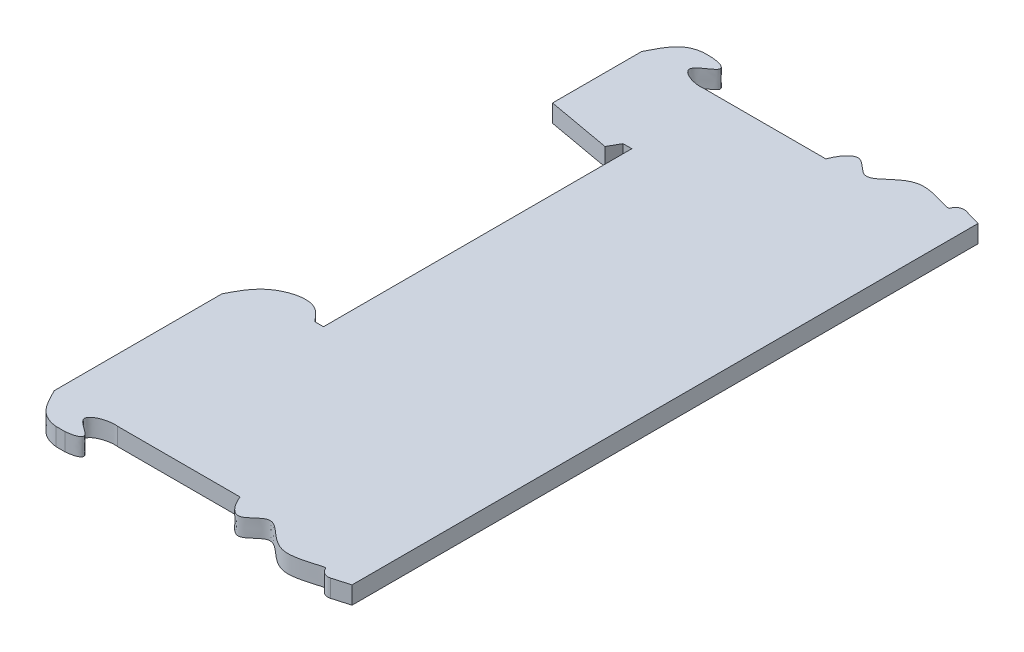
ISO-10303-21;
HEADER;
FILE_DESCRIPTION(('STEP AP214'),'2;1');
FILE_NAME('part.step','',(''),(''),'','','');
FILE_SCHEMA(('AUTOMOTIVE_DESIGN { 1 0 10303 214 1 1 1 1 }'));
ENDSEC;
DATA;
#1=APPLICATION_CONTEXT('core data for automotive mechanical design processes');
#2=APPLICATION_PROTOCOL_DEFINITION('international standard','automotive_design',2000,#1);
#3=PRODUCT_CONTEXT('',#1,'mechanical');
#4=PRODUCT('Part','Part','',(#3));
#5=PRODUCT_RELATED_PRODUCT_CATEGORY('part','',(#4));
#6=PRODUCT_DEFINITION_FORMATION('','',#4);
#7=PRODUCT_DEFINITION_CONTEXT('part definition',#1,'design');
#8=PRODUCT_DEFINITION('design','',#6,#7);
#9=PRODUCT_DEFINITION_SHAPE('','',#8);
#10=(LENGTH_UNIT() NAMED_UNIT(*) SI_UNIT(.MILLI.,.METRE.));
#11=(NAMED_UNIT(*) PLANE_ANGLE_UNIT() SI_UNIT($,.RADIAN.));
#12=(NAMED_UNIT(*) SI_UNIT($,.STERADIAN.) SOLID_ANGLE_UNIT());
#13=UNCERTAINTY_MEASURE_WITH_UNIT(LENGTH_MEASURE(1.E-05),#10,'distance_accuracy_value','');
#14=(GEOMETRIC_REPRESENTATION_CONTEXT(3) GLOBAL_UNCERTAINTY_ASSIGNED_CONTEXT((#13)) GLOBAL_UNIT_ASSIGNED_CONTEXT((#10,
#11,#12)) REPRESENTATION_CONTEXT('',''));
#15=CARTESIAN_POINT('',(0.,0.,0.));
#16=DIRECTION('',(0.,0.,1.));
#17=DIRECTION('',(1.,0.,0.));
#18=AXIS2_PLACEMENT_3D('',#15,#16,#17);
#19=CARTESIAN_POINT('',(18.,-5.2,36.75));
#20=DIRECTION('',(1.,0.,0.));
#21=DIRECTION('',(0.,0.,-1.));
#22=AXIS2_PLACEMENT_3D('',#19,#20,#21);
#23=PLANE('',#22);
#24=DIRECTION('',(0.,0.,-1.));
#25=VECTOR('',#24,1.);
#26=CARTESIAN_POINT('',(18.,-3.2,36.75));
#27=LINE('',#26,#25);
#28=CARTESIAN_POINT('',(18.,-3.2,35.5290024315562));
#29=VERTEX_POINT('',#28);
#30=CARTESIAN_POINT('',(18.,-3.2,-35.5290024315562));
#31=VERTEX_POINT('',#30);
#32=EDGE_CURVE('E219',#29,#31,#27,.T.);
#33=ORIENTED_EDGE('',*,*,#32,.F.);
#34=DIRECTION('',(0.,-1.,0.));
#35=VECTOR('',#34,1.);
#36=CARTESIAN_POINT('',(18.,12.8155228725859,35.5290024315562));
#37=LINE('',#36,#35);
#38=CARTESIAN_POINT('',(18.,-5.2,35.5290024315562));
#39=VERTEX_POINT('',#38);
#40=EDGE_CURVE('E399',#29,#39,#37,.T.);
#41=ORIENTED_EDGE('',*,*,#40,.T.);
#42=DIRECTION('',(0.,0.,-1.));
#43=VECTOR('',#42,1.);
#44=CARTESIAN_POINT('',(18.,-5.2,36.75));
#45=LINE('',#44,#43);
#46=CARTESIAN_POINT('',(18.,-5.2,-35.5290024315562));
#47=VERTEX_POINT('',#46);
#48=EDGE_CURVE('E447',#39,#47,#45,.T.);
#49=ORIENTED_EDGE('',*,*,#48,.T.);
#50=DIRECTION('',(0.,-1.,0.));
#51=VECTOR('',#50,1.);
#52=CARTESIAN_POINT('',(18.,12.8155228725859,-35.5290024315562));
#53=LINE('',#52,#51);
#54=EDGE_CURVE('E477',#31,#47,#53,.T.);
#55=ORIENTED_EDGE('',*,*,#54,.F.);
#56=EDGE_LOOP('',(#33,#41,#49,#55));
#57=FACE_BOUND('',#56,.T.);
#58=ADVANCED_FACE('F18',(#57),#23,.T.);
#59=CARTESIAN_POINT('',(0.,-3.2,0.));
#60=DIRECTION('',(0.,1.,0.));
#61=DIRECTION('',(0.,0.,1.));
#62=AXIS2_PLACEMENT_3D('',#59,#60,#61);
#63=PLANE('',#62);
#64=DIRECTION('',(-0.960334640778332,0.,-0.278850099015855));
#65=VECTOR('',#64,1.);
#66=CARTESIAN_POINT('',(10.9139233862696,-3.2,-37.586569743479));
#67=LINE('',#66,#65);
#68=CARTESIAN_POINT('',(16.1226792681748,-3.2,-36.0741156136962));
#69=VERTEX_POINT('',#68);
#70=EDGE_CURVE('E216',#31,#69,#67,.T.);
#71=ORIENTED_EDGE('',*,*,#70,.T.);
#72=CARTESIAN_POINT('',(15.843829169159,-3.2,-35.1137809729179));
#73=DIRECTION('',(0.,1.,0.));
#74=DIRECTION('',(0.,0.,1.));
#75=AXIS2_PLACEMENT_3D('',#72,#73,#74);
#76=CIRCLE('',#75,1.);
#77=CARTESIAN_POINT('',(14.8953796117993,-3.2,-35.4307090990666));
#78=VERTEX_POINT('',#77);
#79=EDGE_CURVE('E11',#69,#78,#76,.T.);
#80=ORIENTED_EDGE('',*,*,#79,.T.);
#81=CARTESIAN_POINT('',(3.00913606257908,-3.2,-33.242524045389));
#82=CARTESIAN_POINT('',(3.34394664913683,-3.2,-34.149968857225));
#83=CARTESIAN_POINT('',(4.66208874772011,-3.2,-36.1968047385293));
#84=CARTESIAN_POINT('',(7.44187242346422,-3.2,-32.2204982551719));
#85=CARTESIAN_POINT('',(9.70858705585306,-3.2,-37.9023329455668));
#86=CARTESIAN_POINT('',(16.0944724333241,-3.2,-34.3443957451506));
#87=CARTESIAN_POINT('',(14.271829047182,-3.2,-36.3841670545182));
#88=CARTESIAN_POINT('',(13.7949942803641,-3.2,-36.75));
#89=B_SPLINE_CURVE_WITH_KNOTS('',3,(#81,#82,#83,#84,#85,#86,#87,#88),.UNSPECIFIED.,.F.,.F.,(4,1,
1,1,1,4),(0.,0.172582068816832,0.317794724151336,0.633383270513378,0.89276460620187,1.),.UNSPECIFIED.);
#90=CARTESIAN_POINT('',(3.00913606257908,-3.2,-33.242524045389));
#91=VERTEX_POINT('',#90);
#92=EDGE_CURVE('E126',#78,#91,#89,.F.);
#93=ORIENTED_EDGE('',*,*,#92,.T.);
#94=DIRECTION('',(-1.,0.,0.));
#95=VECTOR('',#94,1.);
#96=CARTESIAN_POINT('',(0.,-3.2,-33.242524045389));
#97=LINE('',#96,#95);
#98=CARTESIAN_POINT('',(-10.9089135006158,-3.2,-33.242524045389));
#99=VERTEX_POINT('',#98);
#100=EDGE_CURVE('E302',#91,#99,#97,.T.);
#101=ORIENTED_EDGE('',*,*,#100,.T.);
#102=CARTESIAN_POINT('',(-13.3800349437671,-3.2,-36.75));
#103=CARTESIAN_POINT('',(-12.5292903543223,-3.2,-36.6777766997607));
#104=CARTESIAN_POINT('',(-10.8142711101948,-3.2,-36.1236577690734));
#105=CARTESIAN_POINT('',(-15.160513473741,-3.2,-34.2468955948164));
#106=CARTESIAN_POINT('',(-11.9595228161076,-3.2,-33.0989340595605));
#107=CARTESIAN_POINT('',(-10.9089135006158,-3.2,-33.242524045389));
#108=B_SPLINE_CURVE_WITH_KNOTS('',3,(#102,#103,#104,#105,#106,#107),.UNSPECIFIED.,.F.,.F.,(4,1,
1,4),(0.,0.263554408092284,0.594106929046082,1.),.UNSPECIFIED.);
#109=CARTESIAN_POINT('',(-13.3800349437671,-3.2,-36.75));
#110=VERTEX_POINT('',#109);
#111=EDGE_CURVE('E296',#99,#110,#108,.F.);
#112=ORIENTED_EDGE('',*,*,#111,.T.);
#113=DIRECTION('',(-1.,0.,0.));
#114=VECTOR('',#113,1.);
#115=CARTESIAN_POINT('',(18.,-3.2,-36.75));
#116=LINE('',#115,#114);
#117=CARTESIAN_POINT('',(-14.3883371317396,-3.2,-36.75));
#118=VERTEX_POINT('',#117);
#119=EDGE_CURVE('E222',#110,#118,#116,.T.);
#120=ORIENTED_EDGE('',*,*,#119,.T.);
#121=CARTESIAN_POINT('',(-18.,-3.2,-33.3419361491354));
#122=CARTESIAN_POINT('',(-17.1670048895105,-3.2,-34.9610055613672));
#123=CARTESIAN_POINT('',(-16.5120609184126,-3.2,-36.5502275298261));
#124=CARTESIAN_POINT('',(-14.3883371317396,-3.2,-36.75));
#125=B_SPLINE_CURVE_WITH_KNOTS('',3,(#121,#122,#123,#124),.UNSPECIFIED.,.F.,.F.,(4,4),(0.,1.),.UNSPECIFIED.);
#126=CARTESIAN_POINT('',(-18.,-3.2,-33.3419361491354));
#127=VERTEX_POINT('',#126);
#128=EDGE_CURVE('E284',#118,#127,#125,.F.);
#129=ORIENTED_EDGE('',*,*,#128,.T.);
#130=DIRECTION('',(0.,0.,1.));
#131=VECTOR('',#130,1.);
#132=CARTESIAN_POINT('',(-18.,-3.2,-36.75));
#133=LINE('',#132,#131);
#134=CARTESIAN_POINT('',(-18.,-3.2,-23.2298126801153));
#135=VERTEX_POINT('',#134);
#136=EDGE_CURVE('E261',#127,#135,#133,.T.);
#137=ORIENTED_EDGE('',*,*,#136,.T.);
#138=DIRECTION('',(-0.984246247911353,0.,-0.176803064092297));
#139=VECTOR('',#138,1.);
#140=CARTESIAN_POINT('',(3.47973196997268,-3.2,-19.3713449072064));
#141=LINE('',#140,#139);
#142=CARTESIAN_POINT('',(-10.7416100589357,-3.2,-21.9259666307347));
#143=VERTEX_POINT('',#142);
#144=EDGE_CURVE('E247',#143,#135,#141,.T.);
#145=ORIENTED_EDGE('',*,*,#144,.F.);
#146=DIRECTION('',(-0.494406705957166,0.,0.869230699587045));
#147=VECTOR('',#146,1.);
#148=CARTESIAN_POINT('',(-17.5387130903516,-3.2,-9.97578360940098));
#149=LINE('',#148,#147);
#150=CARTESIAN_POINT('',(-10.,-3.2,-23.2298126801153));
#151=VERTEX_POINT('',#150);
#152=EDGE_CURVE('E276',#151,#143,#149,.T.);
#153=ORIENTED_EDGE('',*,*,#152,.F.);
#154=DIRECTION('',(-1.,0.,0.));
#155=VECTOR('',#154,1.);
#156=CARTESIAN_POINT('',(0.,-3.2,-23.2298126801153));
#157=LINE('',#156,#155);
#158=CARTESIAN_POINT('',(-9.,-3.2,-23.2298126801153));
#159=VERTEX_POINT('',#158);
#160=EDGE_CURVE('E274',#159,#151,#157,.T.);
#161=ORIENTED_EDGE('',*,*,#160,.F.);
#162=DIRECTION('',(0.,0.,-1.));
#163=VECTOR('',#162,1.);
#164=CARTESIAN_POINT('',(-9.,-3.2,0.));
#165=LINE('',#164,#163);
#166=CARTESIAN_POINT('',(-9.,-3.2,11.7701873198847));
#167=VERTEX_POINT('',#166);
#168=EDGE_CURVE('E272',#167,#159,#165,.T.);
#169=ORIENTED_EDGE('',*,*,#168,.F.);
#170=DIRECTION('',(1.,0.,0.));
#171=VECTOR('',#170,1.);
#172=CARTESIAN_POINT('',(0.,-3.2,11.7701873198847));
#173=LINE('',#172,#171);
#174=CARTESIAN_POINT('',(-10.,-3.2,11.7701873198847));
#175=VERTEX_POINT('',#174);
#176=EDGE_CURVE('E266',#175,#167,#173,.T.);
#177=ORIENTED_EDGE('',*,*,#176,.F.);
#178=CARTESIAN_POINT('',(-10.,-3.2,11.7701873198847));
#179=CARTESIAN_POINT('',(-10.4766283127593,-3.2,11.1657315515805));
#180=CARTESIAN_POINT('',(-11.8182497629508,-3.2,9.56827475012417));
#181=CARTESIAN_POINT('',(-16.0576619839344,-3.2,10.7099109528241));
#182=CARTESIAN_POINT('',(-17.3288762015723,-3.2,12.9543463623666));
#183=CARTESIAN_POINT('',(-18.,-3.2,14.3089544996092));
#184=B_SPLINE_CURVE_WITH_KNOTS('',3,(#178,#179,#180,#181,#182,#183),.UNSPECIFIED.,.F.,.F.,(4,1,
1,4),(0.,0.204787098549057,0.597818984755,1.),.UNSPECIFIED.);
#185=CARTESIAN_POINT('',(-18.,-3.2,14.3089544996092));
#186=VERTEX_POINT('',#185);
#187=EDGE_CURVE('E262',#186,#175,#184,.F.);
#188=ORIENTED_EDGE('',*,*,#187,.F.);
#189=DIRECTION('',(0.,0.,1.));
#190=VECTOR('',#189,1.);
#191=CARTESIAN_POINT('',(-18.,-3.2,-36.75));
#192=LINE('',#191,#190);
#193=CARTESIAN_POINT('',(-18.,-3.2,33.3419361491354));
#194=VERTEX_POINT('',#193);
#195=EDGE_CURVE('E254',#186,#194,#192,.T.);
#196=ORIENTED_EDGE('',*,*,#195,.T.);
#197=CARTESIAN_POINT('',(-14.3883371317396,-3.2,36.75));
#198=CARTESIAN_POINT('',(-16.5120609184126,-3.2,36.5502275298261));
#199=CARTESIAN_POINT('',(-17.1670048895105,-3.2,34.9610055613672));
#200=CARTESIAN_POINT('',(-18.,-3.2,33.3419361491354));
#201=B_SPLINE_CURVE_WITH_KNOTS('',3,(#197,#198,#199,#200),.UNSPECIFIED.,.F.,.F.,(4,4),(0.,1.),.UNSPECIFIED.);
#202=CARTESIAN_POINT('',(-14.3883371317396,-3.2,36.75));
#203=VERTEX_POINT('',#202);
#204=EDGE_CURVE('E248',#194,#203,#201,.F.);
#205=ORIENTED_EDGE('',*,*,#204,.T.);
#206=DIRECTION('',(1.,0.,0.));
#207=VECTOR('',#206,1.);
#208=CARTESIAN_POINT('',(-18.,-3.2,36.75));
#209=LINE('',#208,#207);
#210=CARTESIAN_POINT('',(-13.3800349437672,-3.2,36.75));
#211=VERTEX_POINT('',#210);
#212=EDGE_CURVE('E223',#203,#211,#209,.T.);
#213=ORIENTED_EDGE('',*,*,#212,.T.);
#214=CARTESIAN_POINT('',(-10.9089135006158,-3.2,33.242524045389));
#215=CARTESIAN_POINT('',(-11.9595228161076,-3.2,33.0989340595605));
#216=CARTESIAN_POINT('',(-15.160513473741,-3.2,34.2468955948164));
#217=CARTESIAN_POINT('',(-10.8142711101948,-3.2,36.1236577690734));
#218=CARTESIAN_POINT('',(-12.5292903543224,-3.2,36.6777766997607));
#219=CARTESIAN_POINT('',(-13.3800349437672,-3.2,36.75));
#220=B_SPLINE_CURVE_WITH_KNOTS('',3,(#214,#215,#216,#217,#218,#219),.UNSPECIFIED.,.F.,.F.,(4,1,
1,4),(0.,0.405893070953915,0.73644559190771,1.),.UNSPECIFIED.);
#221=CARTESIAN_POINT('',(-10.9089135006158,-3.2,33.242524045389));
#222=VERTEX_POINT('',#221);
#223=EDGE_CURVE('E237',#211,#222,#220,.F.);
#224=ORIENTED_EDGE('',*,*,#223,.T.);
#225=DIRECTION('',(1.,0.,0.));
#226=VECTOR('',#225,1.);
#227=CARTESIAN_POINT('',(0.,-3.2,33.242524045389));
#228=LINE('',#227,#226);
#229=CARTESIAN_POINT('',(3.00913606257908,-3.2,33.242524045389));
#230=VERTEX_POINT('',#229);
#231=EDGE_CURVE('E230',#222,#230,#228,.T.);
#232=ORIENTED_EDGE('',*,*,#231,.T.);
#233=CARTESIAN_POINT('',(13.7949942803641,-3.2,36.75));
#234=CARTESIAN_POINT('',(14.271829047182,-3.2,36.3841670545182));
#235=CARTESIAN_POINT('',(16.0944724333241,-3.2,34.3443957451506));
#236=CARTESIAN_POINT('',(9.70858705585306,-3.2,37.9023329455668));
#237=CARTESIAN_POINT('',(7.44187242346422,-3.2,32.2204982551719));
#238=CARTESIAN_POINT('',(4.66208874772011,-3.2,36.1968047385293));
#239=CARTESIAN_POINT('',(3.34394664913683,-3.2,34.149968857225));
#240=CARTESIAN_POINT('',(3.00913606257908,-3.2,33.242524045389));
#241=B_SPLINE_CURVE_WITH_KNOTS('',3,(#233,#234,#235,#236,#237,#238,#239,#240),.UNSPECIFIED.,.F.,
.F.,(4,1,1,1,1,4),(0.,0.10723539379813,0.366616729486621,0.682205275848664,0.827417931183168,
1.),.UNSPECIFIED.);
#242=CARTESIAN_POINT('',(14.8953796117993,-3.2,35.4307090990666));
#243=VERTEX_POINT('',#242);
#244=EDGE_CURVE('E226',#230,#243,#241,.F.);
#245=ORIENTED_EDGE('',*,*,#244,.T.);
#246=CARTESIAN_POINT('',(15.843829169159,-3.2,35.1137809729178));
#247=DIRECTION('',(0.,1.,0.));
#248=DIRECTION('',(0.,0.,1.));
#249=AXIS2_PLACEMENT_3D('',#246,#247,#248);
#250=CIRCLE('',#249,1.);
#251=CARTESIAN_POINT('',(16.1226792681749,-3.2,36.0741156136962));
#252=VERTEX_POINT('',#251);
#253=EDGE_CURVE('E206',#243,#252,#250,.T.);
#254=ORIENTED_EDGE('',*,*,#253,.T.);
#255=DIRECTION('',(0.960334640778332,0.,-0.278850099015855));
#256=VECTOR('',#255,1.);
#257=CARTESIAN_POINT('',(10.9139233862696,-3.2,37.586569743479));
#258=LINE('',#257,#256);
#259=EDGE_CURVE('E218',#252,#29,#258,.T.);
#260=ORIENTED_EDGE('',*,*,#259,.T.);
#261=ORIENTED_EDGE('',*,*,#32,.T.);
#262=EDGE_LOOP('',(#71,#80,#93,#101,#112,#120,#129,#137,#145,#153,#161,#169,#177,#188,#196,#205,
#213,#224,#232,#245,#254,#260,#261));
#263=FACE_BOUND('',#262,.T.);
#264=ADVANCED_FACE('F20',(#263),#63,.T.);
#265=CARTESIAN_POINT('',(18.,-5.2,-36.75));
#266=DIRECTION('',(0.,0.,-1.));
#267=DIRECTION('',(-1.,0.,0.));
#268=AXIS2_PLACEMENT_3D('',#265,#266,#267);
#269=PLANE('',#268);
#270=ORIENTED_EDGE('',*,*,#119,.F.);
#271=DIRECTION('',(0.,-1.,0.));
#272=VECTOR('',#271,1.);
#273=CARTESIAN_POINT('',(-13.3800349437671,12.8155228725859,-36.75));
#274=LINE('',#273,#272);
#275=CARTESIAN_POINT('',(-13.3800349437671,-5.2,-36.75));
#276=VERTEX_POINT('',#275);
#277=EDGE_CURVE('E306',#110,#276,#274,.T.);
#278=ORIENTED_EDGE('',*,*,#277,.T.);
#279=DIRECTION('',(-1.,0.,0.));
#280=VECTOR('',#279,1.);
#281=CARTESIAN_POINT('',(18.,-5.2,-36.75));
#282=LINE('',#281,#280);
#283=CARTESIAN_POINT('',(-14.3883371317396,-5.2,-36.75));
#284=VERTEX_POINT('',#283);
#285=EDGE_CURVE('E451',#276,#284,#282,.T.);
#286=ORIENTED_EDGE('',*,*,#285,.T.);
#287=DIRECTION('',(0.,-1.,0.));
#288=VECTOR('',#287,1.);
#289=CARTESIAN_POINT('',(-14.3883371317396,12.8155228725859,-36.75));
#290=LINE('',#289,#288);
#291=EDGE_CURVE('E290',#118,#284,#290,.T.);
#292=ORIENTED_EDGE('',*,*,#291,.F.);
#293=EDGE_LOOP('',(#270,#278,#286,#292));
#294=FACE_BOUND('',#293,.T.);
#295=ADVANCED_FACE('F516',(#294),#269,.T.);
#296=CARTESIAN_POINT('',(-18.,-5.2,-36.75));
#297=DIRECTION('',(-1.,0.,0.));
#298=DIRECTION('',(0.,0.,1.));
#299=AXIS2_PLACEMENT_3D('',#296,#297,#298);
#300=PLANE('',#299);
#301=ORIENTED_EDGE('',*,*,#136,.F.);
#302=DIRECTION('',(0.,-1.,0.));
#303=VECTOR('',#302,1.);
#304=CARTESIAN_POINT('',(-18.,12.8155228725859,-33.3419361491354));
#305=LINE('',#304,#303);
#306=CARTESIAN_POINT('',(-18.,-5.2,-33.3419361491354));
#307=VERTEX_POINT('',#306);
#308=EDGE_CURVE('E556',#127,#307,#305,.T.);
#309=ORIENTED_EDGE('',*,*,#308,.T.);
#310=DIRECTION('',(0.,0.,1.));
#311=VECTOR('',#310,1.);
#312=CARTESIAN_POINT('',(-18.,-5.2,-36.75));
#313=LINE('',#312,#311);
#314=CARTESIAN_POINT('',(-18.,-5.2,-23.2298126801153));
#315=VERTEX_POINT('',#314);
#316=EDGE_CURVE('E224',#307,#315,#313,.T.);
#317=ORIENTED_EDGE('',*,*,#316,.T.);
#318=DIRECTION('',(0.,-1.,0.));
#319=VECTOR('',#318,1.);
#320=CARTESIAN_POINT('',(-18.,34.6858787151251,-23.2298126801153));
#321=LINE('',#320,#319);
#322=EDGE_CURVE('E267',#135,#315,#321,.T.);
#323=ORIENTED_EDGE('',*,*,#322,.F.);
#324=EDGE_LOOP('',(#301,#309,#317,#323));
#325=FACE_BOUND('',#324,.T.);
#326=ADVANCED_FACE('F523',(#325),#300,.T.);
#327=CARTESIAN_POINT('',(-18.,-5.2,36.75));
#328=DIRECTION('',(0.,0.,1.));
#329=DIRECTION('',(1.,0.,0.));
#330=AXIS2_PLACEMENT_3D('',#327,#328,#329);
#331=PLANE('',#330);
#332=ORIENTED_EDGE('',*,*,#212,.F.);
#333=DIRECTION('',(0.,-1.,0.));
#334=VECTOR('',#333,1.);
#335=CARTESIAN_POINT('',(-14.3883371317396,12.8155228725859,36.75));
#336=LINE('',#335,#334);
#337=CARTESIAN_POINT('',(-14.3883371317396,-5.2,36.75));
#338=VERTEX_POINT('',#337);
#339=EDGE_CURVE('E253',#203,#338,#336,.T.);
#340=ORIENTED_EDGE('',*,*,#339,.T.);
#341=DIRECTION('',(1.,0.,0.));
#342=VECTOR('',#341,1.);
#343=CARTESIAN_POINT('',(-18.,-5.2,36.75));
#344=LINE('',#343,#342);
#345=CARTESIAN_POINT('',(-13.3800349437672,-5.2,36.75));
#346=VERTEX_POINT('',#345);
#347=EDGE_CURVE('E283',#338,#346,#344,.T.);
#348=ORIENTED_EDGE('',*,*,#347,.T.);
#349=DIRECTION('',(0.,-1.,0.));
#350=VECTOR('',#349,1.);
#351=CARTESIAN_POINT('',(-13.3800349437672,12.8155228725859,36.75));
#352=LINE('',#351,#350);
#353=EDGE_CURVE('E231',#211,#346,#352,.T.);
#354=ORIENTED_EDGE('',*,*,#353,.F.);
#355=EDGE_LOOP('',(#332,#340,#348,#354));
#356=FACE_BOUND('',#355,.T.);
#357=ADVANCED_FACE('F520',(#356),#331,.T.);
#358=DIRECTION('',(0.,-1.,0.));
#359=VECTOR('',#358,1.);
#360=CARTESIAN_POINT('',(-18.,12.8155228725859,33.3419361491354));
#361=LINE('',#360,#359);
#362=CARTESIAN_POINT('',(-18.,-5.2,33.3419361491354));
#363=VERTEX_POINT('',#362);
#364=EDGE_CURVE('E360',#194,#363,#361,.T.);
#365=ORIENTED_EDGE('',*,*,#364,.F.);
#366=ORIENTED_EDGE('',*,*,#195,.F.);
#367=DIRECTION('',(0.,-1.,0.));
#368=VECTOR('',#367,1.);
#369=CARTESIAN_POINT('',(-18.,34.6858787151251,14.3089544996092));
#370=LINE('',#369,#368);
#371=CARTESIAN_POINT('',(-18.,-5.2,14.3089544996092));
#372=VERTEX_POINT('',#371);
#373=EDGE_CURVE('E429',#186,#372,#370,.T.);
#374=ORIENTED_EDGE('',*,*,#373,.T.);
#375=EDGE_CURVE('E453',#372,#363,#313,.T.);
#376=ORIENTED_EDGE('',*,*,#375,.T.);
#377=EDGE_LOOP('',(#365,#366,#374,#376));
#378=FACE_BOUND('',#377,.T.);
#379=ADVANCED_FACE('F522',(#378),#300,.T.);
#380=CARTESIAN_POINT('',(0.,-5.2,0.));
#381=DIRECTION('',(0.,1.,0.));
#382=DIRECTION('',(0.,0.,1.));
#383=AXIS2_PLACEMENT_3D('',#380,#381,#382);
#384=PLANE('',#383);
#385=CARTESIAN_POINT('',(3.00913606257908,-5.2,-33.242524045389));
#386=CARTESIAN_POINT('',(3.34394664913683,-5.2,-34.149968857225));
#387=CARTESIAN_POINT('',(4.66208874772011,-5.2,-36.1968047385293));
#388=CARTESIAN_POINT('',(7.44187242346422,-5.2,-32.2204982551719));
#389=CARTESIAN_POINT('',(9.70858705585306,-5.2,-37.9023329455668));
#390=CARTESIAN_POINT('',(16.0944724333241,-5.2,-34.3443957451506));
#391=CARTESIAN_POINT('',(14.271829047182,-5.2,-36.3841670545182));
#392=CARTESIAN_POINT('',(13.7949942803641,-5.2,-36.75));
#393=B_SPLINE_CURVE_WITH_KNOTS('',3,(#385,#386,#387,#388,#389,#390,#391,#392),.UNSPECIFIED.,.F.,
.F.,(4,1,1,1,1,4),(0.,0.172582068816832,0.317794724151336,0.633383270513378,0.89276460620187,
1.),.UNSPECIFIED.);
#394=CARTESIAN_POINT('',(3.00913606257908,-5.2,-33.242524045389));
#395=VERTEX_POINT('',#394);
#396=CARTESIAN_POINT('',(14.8953796117993,-5.2,-35.4307090990666));
#397=VERTEX_POINT('',#396);
#398=EDGE_CURVE('E480',#395,#397,#393,.T.);
#399=ORIENTED_EDGE('',*,*,#398,.T.);
#400=CARTESIAN_POINT('',(15.843829169159,-5.2,-35.1137809729179));
#401=DIRECTION('',(0.,1.,0.));
#402=DIRECTION('',(0.,0.,1.));
#403=AXIS2_PLACEMENT_3D('',#400,#401,#402);
#404=CIRCLE('',#403,1.);
#405=CARTESIAN_POINT('',(16.1226792681748,-5.2,-36.0741156136962));
#406=VERTEX_POINT('',#405);
#407=EDGE_CURVE('E41',#397,#406,#404,.F.);
#408=ORIENTED_EDGE('',*,*,#407,.T.);
#409=DIRECTION('',(0.960334640778332,0.,0.278850099015855));
#410=VECTOR('',#409,1.);
#411=CARTESIAN_POINT('',(13.7949942803641,-5.2,-36.75));
#412=LINE('',#411,#410);
#413=EDGE_CURVE('E474',#406,#47,#412,.T.);
#414=ORIENTED_EDGE('',*,*,#413,.T.);
#415=ORIENTED_EDGE('',*,*,#48,.F.);
#416=DIRECTION('',(-0.960334640778332,0.,0.278850099015855));
#417=VECTOR('',#416,1.);
#418=CARTESIAN_POINT('',(13.7949942803641,-5.2,36.75));
#419=LINE('',#418,#417);
#420=CARTESIAN_POINT('',(16.1226792681748,-5.2,36.0741156136962));
#421=VERTEX_POINT('',#420);
#422=EDGE_CURVE('E186',#39,#421,#419,.T.);
#423=ORIENTED_EDGE('',*,*,#422,.T.);
#424=CARTESIAN_POINT('',(15.843829169159,-5.2,35.1137809729178));
#425=DIRECTION('',(0.,1.,0.));
#426=DIRECTION('',(0.,0.,1.));
#427=AXIS2_PLACEMENT_3D('',#424,#425,#426);
#428=CIRCLE('',#427,1.);
#429=CARTESIAN_POINT('',(14.8953796117993,-5.2,35.4307090990666));
#430=VERTEX_POINT('',#429);
#431=EDGE_CURVE('E179',#421,#430,#428,.F.);
#432=ORIENTED_EDGE('',*,*,#431,.T.);
#433=CARTESIAN_POINT('',(13.7949942803641,-5.2,36.75));
#434=CARTESIAN_POINT('',(14.271829047182,-5.2,36.3841670545182));
#435=CARTESIAN_POINT('',(16.0944724333241,-5.2,34.3443957451506));
#436=CARTESIAN_POINT('',(9.70858705585306,-5.2,37.9023329455668));
#437=CARTESIAN_POINT('',(7.44187242346422,-5.2,32.2204982551719));
#438=CARTESIAN_POINT('',(4.66208874772011,-5.2,36.1968047385293));
#439=CARTESIAN_POINT('',(3.34394664913683,-5.2,34.149968857225));
#440=CARTESIAN_POINT('',(3.00913606257908,-5.2,33.242524045389));
#441=B_SPLINE_CURVE_WITH_KNOTS('',3,(#433,#434,#435,#436,#437,#438,#439,#440),.UNSPECIFIED.,.F.,
.F.,(4,1,1,1,1,4),(0.,0.10723539379813,0.366616729486621,0.682205275848664,0.827417931183168,
1.),.UNSPECIFIED.);
#442=CARTESIAN_POINT('',(3.00913606257908,-5.2,33.242524045389));
#443=VERTEX_POINT('',#442);
#444=EDGE_CURVE('E183',#430,#443,#441,.T.);
#445=ORIENTED_EDGE('',*,*,#444,.T.);
#446=DIRECTION('',(-1.,0.,0.));
#447=VECTOR('',#446,1.);
#448=CARTESIAN_POINT('',(-10.9089135006158,-5.2,33.242524045389));
#449=LINE('',#448,#447);
#450=CARTESIAN_POINT('',(-10.9089135006158,-5.2,33.242524045389));
#451=VERTEX_POINT('',#450);
#452=EDGE_CURVE('E201',#443,#451,#449,.T.);
#453=ORIENTED_EDGE('',*,*,#452,.T.);
#454=CARTESIAN_POINT('',(-10.9089135006158,-5.2,33.242524045389));
#455=CARTESIAN_POINT('',(-11.9595228161076,-5.2,33.0989340595605));
#456=CARTESIAN_POINT('',(-15.160513473741,-5.2,34.2468955948164));
#457=CARTESIAN_POINT('',(-10.8142711101948,-5.2,36.1236577690734));
#458=CARTESIAN_POINT('',(-12.5292903543224,-5.2,36.6777766997607));
#459=CARTESIAN_POINT('',(-13.3800349437672,-5.2,36.75));
#460=B_SPLINE_CURVE_WITH_KNOTS('',3,(#454,#455,#456,#457,#458,#459),.UNSPECIFIED.,.F.,.F.,(4,1,
1,4),(0.,0.405893070953915,0.73644559190771,1.),.UNSPECIFIED.);
#461=EDGE_CURVE('E202',#451,#346,#460,.T.);
#462=ORIENTED_EDGE('',*,*,#461,.T.);
#463=ORIENTED_EDGE('',*,*,#347,.F.);
#464=CARTESIAN_POINT('',(-14.3883371317396,-5.2,36.75));
#465=CARTESIAN_POINT('',(-16.5120609184126,-5.2,36.5502275298261));
#466=CARTESIAN_POINT('',(-17.1670048895105,-5.2,34.9610055613672));
#467=CARTESIAN_POINT('',(-18.,-5.2,33.3419361491354));
#468=B_SPLINE_CURVE_WITH_KNOTS('',3,(#464,#465,#466,#467),.UNSPECIFIED.,.F.,.F.,(4,4),(0.,1.),.UNSPECIFIED.);
#469=EDGE_CURVE('E289',#338,#363,#468,.T.);
#470=ORIENTED_EDGE('',*,*,#469,.T.);
#471=ORIENTED_EDGE('',*,*,#375,.F.);
#472=CARTESIAN_POINT('',(-10.,-5.2,11.7701873198847));
#473=CARTESIAN_POINT('',(-10.4766283127593,-5.2,11.1657315515805));
#474=CARTESIAN_POINT('',(-11.8182497629508,-5.2,9.56827475012417));
#475=CARTESIAN_POINT('',(-16.0576619839344,-5.2,10.7099109528241));
#476=CARTESIAN_POINT('',(-17.3288762015723,-5.2,12.9543463623666));
#477=CARTESIAN_POINT('',(-18.,-5.2,14.3089544996092));
#478=B_SPLINE_CURVE_WITH_KNOTS('',3,(#472,#473,#474,#475,#476,#477),.UNSPECIFIED.,.F.,.F.,(4,1,
1,4),(0.,0.204787098549057,0.597818984755,1.),.UNSPECIFIED.);
#479=CARTESIAN_POINT('',(-10.,-5.2,11.7701873198847));
#480=VERTEX_POINT('',#479);
#481=EDGE_CURVE('E424',#480,#372,#478,.T.);
#482=ORIENTED_EDGE('',*,*,#481,.F.);
#483=DIRECTION('',(-1.,0.,0.));
#484=VECTOR('',#483,1.);
#485=CARTESIAN_POINT('',(-9.,-5.2,11.7701873198847));
#486=LINE('',#485,#484);
#487=CARTESIAN_POINT('',(-9.,-5.2,11.7701873198847));
#488=VERTEX_POINT('',#487);
#489=EDGE_CURVE('E420',#488,#480,#486,.T.);
#490=ORIENTED_EDGE('',*,*,#489,.F.);
#491=DIRECTION('',(0.,0.,1.));
#492=VECTOR('',#491,1.);
#493=CARTESIAN_POINT('',(-9.,-5.2,-23.2298126801153));
#494=LINE('',#493,#492);
#495=CARTESIAN_POINT('',(-9.,-5.2,-23.2298126801153));
#496=VERTEX_POINT('',#495);
#497=EDGE_CURVE('E416',#496,#488,#494,.T.);
#498=ORIENTED_EDGE('',*,*,#497,.F.);
#499=DIRECTION('',(1.,0.,0.));
#500=VECTOR('',#499,1.);
#501=CARTESIAN_POINT('',(-9.,-5.2,-23.2298126801153));
#502=LINE('',#501,#500);
#503=CARTESIAN_POINT('',(-10.,-5.2,-23.2298126801153));
#504=VERTEX_POINT('',#503);
#505=EDGE_CURVE('E412',#504,#496,#502,.T.);
#506=ORIENTED_EDGE('',*,*,#505,.F.);
#507=DIRECTION('',(0.494406705957166,0.,-0.869230699587045));
#508=VECTOR('',#507,1.);
#509=CARTESIAN_POINT('',(-10.,-5.2,-23.2298126801153));
#510=LINE('',#509,#508);
#511=CARTESIAN_POINT('',(-10.7416100589357,-5.2,-21.9259666307347));
#512=VERTEX_POINT('',#511);
#513=EDGE_CURVE('E408',#512,#504,#510,.T.);
#514=ORIENTED_EDGE('',*,*,#513,.F.);
#515=DIRECTION('',(0.984246247911352,0.,0.176803064092297));
#516=VECTOR('',#515,1.);
#517=CARTESIAN_POINT('',(-10.7416100589357,-5.2,-21.9259666307347));
#518=LINE('',#517,#516);
#519=EDGE_CURVE('E401',#315,#512,#518,.T.);
#520=ORIENTED_EDGE('',*,*,#519,.F.);
#521=ORIENTED_EDGE('',*,*,#316,.F.);
#522=CARTESIAN_POINT('',(-18.,-5.2,-33.3419361491354));
#523=CARTESIAN_POINT('',(-17.1670048895105,-5.2,-34.9610055613672));
#524=CARTESIAN_POINT('',(-16.5120609184126,-5.2,-36.5502275298261));
#525=CARTESIAN_POINT('',(-14.3883371317396,-5.2,-36.75));
#526=B_SPLINE_CURVE_WITH_KNOTS('',3,(#522,#523,#524,#525),.UNSPECIFIED.,.F.,.F.,(4,4),(0.,1.),.UNSPECIFIED.);
#527=EDGE_CURVE('E301',#307,#284,#526,.T.);
#528=ORIENTED_EDGE('',*,*,#527,.T.);
#529=ORIENTED_EDGE('',*,*,#285,.F.);
#530=CARTESIAN_POINT('',(-13.3800349437671,-5.2,-36.75));
#531=CARTESIAN_POINT('',(-12.5292903543223,-5.2,-36.6777766997607));
#532=CARTESIAN_POINT('',(-10.8142711101948,-5.2,-36.1236577690734));
#533=CARTESIAN_POINT('',(-15.160513473741,-5.2,-34.2468955948164));
#534=CARTESIAN_POINT('',(-11.9595228161076,-5.2,-33.0989340595605));
#535=CARTESIAN_POINT('',(-10.9089135006158,-5.2,-33.242524045389));
#536=B_SPLINE_CURVE_WITH_KNOTS('',3,(#530,#531,#532,#533,#534,#535),.UNSPECIFIED.,.F.,.F.,(4,1,
1,4),(0.,0.263554408092284,0.594106929046082,1.),.UNSPECIFIED.);
#537=CARTESIAN_POINT('',(-10.9089135006158,-5.2,-33.242524045389));
#538=VERTEX_POINT('',#537);
#539=EDGE_CURVE('E483',#276,#538,#536,.T.);
#540=ORIENTED_EDGE('',*,*,#539,.T.);
#541=DIRECTION('',(1.,0.,0.));
#542=VECTOR('',#541,1.);
#543=CARTESIAN_POINT('',(-10.9089135006158,-5.2,-33.242524045389));
#544=LINE('',#543,#542);
#545=EDGE_CURVE('E536',#538,#395,#544,.T.);
#546=ORIENTED_EDGE('',*,*,#545,.T.);
#547=EDGE_LOOP('',(#399,#408,#414,#415,#423,#432,#445,#453,#462,#463,#470,#471,#482,#490,#498,
#506,#514,#520,#521,#528,#529,#540,#546));
#548=FACE_BOUND('',#547,.T.);
#549=ADVANCED_FACE('F181',(#548),#384,.F.);
#550=CARTESIAN_POINT('',(-10.7416100589357,34.6858787151251,-21.9259666307347));
#551=DIRECTION('',(0.176803064092297,0.,-0.984246247911352));
#552=DIRECTION('',(-0.984246247911353,0.,-0.176803064092297));
#553=AXIS2_PLACEMENT_3D('',#550,#551,#552);
#554=PLANE('',#553);
#555=ORIENTED_EDGE('',*,*,#144,.T.);
#556=ORIENTED_EDGE('',*,*,#322,.T.);
#557=ORIENTED_EDGE('',*,*,#519,.T.);
#558=DIRECTION('',(0.,-1.,0.));
#559=VECTOR('',#558,1.);
#560=CARTESIAN_POINT('',(-10.7416100589357,34.6858787151251,-21.9259666307347));
#561=LINE('',#560,#559);
#562=EDGE_CURVE('E443',#143,#512,#561,.T.);
#563=ORIENTED_EDGE('',*,*,#562,.F.);
#564=EDGE_LOOP('',(#555,#556,#557,#563));
#565=FACE_BOUND('',#564,.T.);
#566=ADVANCED_FACE('F567',(#565),#554,.F.);
#567=CARTESIAN_POINT('',(-10.,34.6858787151251,-23.2298126801153));
#568=DIRECTION('',(-0.869230699587045,0.,-0.494406705957166));
#569=DIRECTION('',(-0.494406705957166,0.,0.869230699587045));
#570=AXIS2_PLACEMENT_3D('',#567,#568,#569);
#571=PLANE('',#570);
#572=ORIENTED_EDGE('',*,*,#152,.T.);
#573=ORIENTED_EDGE('',*,*,#562,.T.);
#574=ORIENTED_EDGE('',*,*,#513,.T.);
#575=DIRECTION('',(0.,-1.,0.));
#576=VECTOR('',#575,1.);
#577=CARTESIAN_POINT('',(-10.,34.6858787151251,-23.2298126801153));
#578=LINE('',#577,#576);
#579=EDGE_CURVE('E441',#151,#504,#578,.T.);
#580=ORIENTED_EDGE('',*,*,#579,.F.);
#581=EDGE_LOOP('',(#572,#573,#574,#580));
#582=FACE_BOUND('',#581,.T.);
#583=ADVANCED_FACE('F573',(#582),#571,.F.);
#584=CARTESIAN_POINT('',(-9.,34.6858787151251,-23.2298126801153));
#585=DIRECTION('',(0.,0.,-1.));
#586=DIRECTION('',(-1.,0.,0.));
#587=AXIS2_PLACEMENT_3D('',#584,#585,#586);
#588=PLANE('',#587);
#589=ORIENTED_EDGE('',*,*,#160,.T.);
#590=ORIENTED_EDGE('',*,*,#579,.T.);
#591=ORIENTED_EDGE('',*,*,#505,.T.);
#592=DIRECTION('',(0.,-1.,0.));
#593=VECTOR('',#592,1.);
#594=CARTESIAN_POINT('',(-9.,34.6858787151251,-23.2298126801153));
#595=LINE('',#594,#593);
#596=EDGE_CURVE('E439',#159,#496,#595,.T.);
#597=ORIENTED_EDGE('',*,*,#596,.F.);
#598=EDGE_LOOP('',(#589,#590,#591,#597));
#599=FACE_BOUND('',#598,.T.);
#600=ADVANCED_FACE('F580',(#599),#588,.F.);
#601=CARTESIAN_POINT('',(-9.,34.6858787151251,-23.2298126801153));
#602=DIRECTION('',(1.,0.,0.));
#603=DIRECTION('',(0.,0.,-1.));
#604=AXIS2_PLACEMENT_3D('',#601,#602,#603);
#605=PLANE('',#604);
#606=ORIENTED_EDGE('',*,*,#168,.T.);
#607=ORIENTED_EDGE('',*,*,#596,.T.);
#608=ORIENTED_EDGE('',*,*,#497,.T.);
#609=DIRECTION('',(0.,-1.,0.));
#610=VECTOR('',#609,1.);
#611=CARTESIAN_POINT('',(-9.,34.6858787151251,11.7701873198847));
#612=LINE('',#611,#610);
#613=EDGE_CURVE('E437',#167,#488,#612,.T.);
#614=ORIENTED_EDGE('',*,*,#613,.F.);
#615=EDGE_LOOP('',(#606,#607,#608,#614));
#616=FACE_BOUND('',#615,.T.);
#617=ADVANCED_FACE('F582',(#616),#605,.F.);
#618=CARTESIAN_POINT('',(-9.,34.6858787151251,11.7701873198847));
#619=DIRECTION('',(0.,0.,1.));
#620=DIRECTION('',(1.,0.,0.));
#621=AXIS2_PLACEMENT_3D('',#618,#619,#620);
#622=PLANE('',#621);
#623=ORIENTED_EDGE('',*,*,#176,.T.);
#624=ORIENTED_EDGE('',*,*,#613,.T.);
#625=ORIENTED_EDGE('',*,*,#489,.T.);
#626=DIRECTION('',(0.,-1.,0.));
#627=VECTOR('',#626,1.);
#628=CARTESIAN_POINT('',(-10.,34.6858787151251,11.7701873198847));
#629=LINE('',#628,#627);
#630=EDGE_CURVE('E435',#175,#480,#629,.T.);
#631=ORIENTED_EDGE('',*,*,#630,.F.);
#632=EDGE_LOOP('',(#623,#624,#625,#631));
#633=FACE_BOUND('',#632,.T.);
#634=ADVANCED_FACE('F391',(#633),#622,.F.);
#635=CARTESIAN_POINT('',(-10.,34.6858787151251,11.7701873198847));
#636=CARTESIAN_POINT('',(-10.4766283127593,34.6858787151251,11.1657315515805));
#637=CARTESIAN_POINT('',(-11.8182497629508,34.6858787151251,9.56827475012417));
#638=CARTESIAN_POINT('',(-16.0576619839344,34.6858787151251,10.7099109528241));
#639=CARTESIAN_POINT('',(-17.3288762015723,34.6858787151251,12.9543463623666));
#640=CARTESIAN_POINT('',(-18.,34.6858787151251,14.3089544996092));
#641=B_SPLINE_CURVE_WITH_KNOTS('',3,(#635,#636,#637,#638,#639,#640),.UNSPECIFIED.,.F.,.F.,(4,1,
1,4),(0.,0.204787098549057,0.597818984755,1.),.UNSPECIFIED.);
#642=DIRECTION('',(0.,-1.,0.));
#643=VECTOR('',#642,1.);
#644=SURFACE_OF_LINEAR_EXTRUSION('',#641,#643);
#645=ORIENTED_EDGE('',*,*,#187,.T.);
#646=ORIENTED_EDGE('',*,*,#630,.T.);
#647=ORIENTED_EDGE('',*,*,#481,.T.);
#648=ORIENTED_EDGE('',*,*,#373,.F.);
#649=EDGE_LOOP('',(#645,#646,#647,#648));
#650=FACE_BOUND('',#649,.T.);
#651=ADVANCED_FACE('F386',(#650),#644,.F.);
#652=CARTESIAN_POINT('',(13.7949942803641,12.8155228725859,36.75));
#653=DIRECTION('',(0.278850099015855,0.,0.960334640778332));
#654=DIRECTION('',(0.960334640778332,0.,-0.278850099015855));
#655=AXIS2_PLACEMENT_3D('',#652,#653,#654);
#656=PLANE('',#655);
#657=ORIENTED_EDGE('',*,*,#259,.F.);
#658=DIRECTION('',(0.,-1.,0.));
#659=VECTOR('',#658,1.);
#660=CARTESIAN_POINT('',(16.1226792681748,12.8155228725859,36.0741156136962));
#661=LINE('',#660,#659);
#662=EDGE_CURVE('E192',#252,#421,#661,.T.);
#663=ORIENTED_EDGE('',*,*,#662,.T.);
#664=ORIENTED_EDGE('',*,*,#422,.F.);
#665=ORIENTED_EDGE('',*,*,#40,.F.);
#666=EDGE_LOOP('',(#657,#663,#664,#665));
#667=FACE_BOUND('',#666,.T.);
#668=ADVANCED_FACE('F382',(#667),#656,.T.);
#669=CARTESIAN_POINT('',(-10.9089135006158,12.8155228725859,33.242524045389));
#670=CARTESIAN_POINT('',(-11.9595228161076,12.8155228725859,33.0989340595605));
#671=CARTESIAN_POINT('',(-15.160513473741,12.8155228725859,34.2468955948164));
#672=CARTESIAN_POINT('',(-10.8142711101948,12.8155228725859,36.1236577690734));
#673=CARTESIAN_POINT('',(-12.5292903543224,12.8155228725859,36.6777766997607));
#674=CARTESIAN_POINT('',(-13.3800349437672,12.8155228725859,36.75));
#675=B_SPLINE_CURVE_WITH_KNOTS('',3,(#669,#670,#671,#672,#673,#674),.UNSPECIFIED.,.F.,.F.,(4,1,
1,4),(0.,0.405893070953915,0.73644559190771,1.),.UNSPECIFIED.);
#676=DIRECTION('',(0.,-1.,0.));
#677=VECTOR('',#676,1.);
#678=SURFACE_OF_LINEAR_EXTRUSION('',#675,#677);
#679=ORIENTED_EDGE('',*,*,#353,.T.);
#680=ORIENTED_EDGE('',*,*,#461,.F.);
#681=DIRECTION('',(0.,-1.,0.));
#682=VECTOR('',#681,1.);
#683=CARTESIAN_POINT('',(-10.9089135006158,12.8155228725859,33.242524045389));
#684=LINE('',#683,#682);
#685=EDGE_CURVE('E462',#222,#451,#684,.T.);
#686=ORIENTED_EDGE('',*,*,#685,.F.);
#687=ORIENTED_EDGE('',*,*,#223,.F.);
#688=EDGE_LOOP('',(#679,#680,#686,#687));
#689=FACE_BOUND('',#688,.T.);
#690=ADVANCED_FACE('F379',(#689),#678,.T.);
#691=CARTESIAN_POINT('',(13.7949942803641,12.8155228725859,36.75));
#692=CARTESIAN_POINT('',(14.271829047182,12.8155228725859,36.3841670545182));
#693=CARTESIAN_POINT('',(16.0944724333241,12.8155228725859,34.3443957451506));
#694=CARTESIAN_POINT('',(9.70858705585306,12.8155228725859,37.9023329455668));
#695=CARTESIAN_POINT('',(7.44187242346422,12.8155228725859,32.2204982551719));
#696=CARTESIAN_POINT('',(4.66208874772011,12.8155228725859,36.1968047385293));
#697=CARTESIAN_POINT('',(3.34394664913683,12.8155228725859,34.149968857225));
#698=CARTESIAN_POINT('',(3.00913606257908,12.8155228725859,33.242524045389));
#699=B_SPLINE_CURVE_WITH_KNOTS('',3,(#691,#692,#693,#694,#695,#696,#697,#698),.UNSPECIFIED.,.F.,
.F.,(4,1,1,1,1,4),(0.,0.10723539379813,0.366616729486621,0.682205275848664,0.827417931183168,
1.),.UNSPECIFIED.);
#700=DIRECTION('',(0.,-1.,0.));
#701=VECTOR('',#700,1.);
#702=SURFACE_OF_LINEAR_EXTRUSION('',#699,#701);
#703=ORIENTED_EDGE('',*,*,#444,.F.);
#704=DIRECTION('',(0.,-1.,0.));
#705=VECTOR('',#704,1.);
#706=CARTESIAN_POINT('',(14.8953796117993,-5.2,35.4307090990666));
#707=LINE('',#706,#705);
#708=EDGE_CURVE('E191',#430,#243,#707,.F.);
#709=ORIENTED_EDGE('',*,*,#708,.T.);
#710=ORIENTED_EDGE('',*,*,#244,.F.);
#711=DIRECTION('',(0.,-1.,0.));
#712=VECTOR('',#711,1.);
#713=CARTESIAN_POINT('',(3.00913606257908,12.8155228725859,33.242524045389));
#714=LINE('',#713,#712);
#715=EDGE_CURVE('E198',#230,#443,#714,.T.);
#716=ORIENTED_EDGE('',*,*,#715,.T.);
#717=EDGE_LOOP('',(#703,#709,#710,#716));
#718=FACE_BOUND('',#717,.T.);
#719=ADVANCED_FACE('F195',(#718),#702,.T.);
#720=CARTESIAN_POINT('',(-10.9089135006158,12.8155228725859,33.242524045389));
#721=DIRECTION('',(0.,0.,1.));
#722=DIRECTION('',(1.,0.,0.));
#723=AXIS2_PLACEMENT_3D('',#720,#721,#722);
#724=PLANE('',#723);
#725=ORIENTED_EDGE('',*,*,#685,.T.);
#726=ORIENTED_EDGE('',*,*,#452,.F.);
#727=ORIENTED_EDGE('',*,*,#715,.F.);
#728=ORIENTED_EDGE('',*,*,#231,.F.);
#729=EDGE_LOOP('',(#725,#726,#727,#728));
#730=FACE_BOUND('',#729,.T.);
#731=ADVANCED_FACE('F344',(#730),#724,.T.);
#732=CARTESIAN_POINT('',(-14.3883371317396,12.8155228725859,36.75));
#733=CARTESIAN_POINT('',(-16.5120609184126,12.8155228725859,36.5502275298261));
#734=CARTESIAN_POINT('',(-17.1670048895105,12.8155228725859,34.9610055613672));
#735=CARTESIAN_POINT('',(-18.,12.8155228725859,33.3419361491354));
#736=B_SPLINE_CURVE_WITH_KNOTS('',3,(#732,#733,#734,#735),.UNSPECIFIED.,.F.,.F.,(4,4),(0.,1.),.UNSPECIFIED.);
#737=DIRECTION('',(0.,-1.,0.));
#738=VECTOR('',#737,1.);
#739=SURFACE_OF_LINEAR_EXTRUSION('',#736,#738);
#740=ORIENTED_EDGE('',*,*,#364,.T.);
#741=ORIENTED_EDGE('',*,*,#469,.F.);
#742=ORIENTED_EDGE('',*,*,#339,.F.);
#743=ORIENTED_EDGE('',*,*,#204,.F.);
#744=EDGE_LOOP('',(#740,#741,#742,#743));
#745=FACE_BOUND('',#744,.T.);
#746=ADVANCED_FACE('F337',(#745),#739,.T.);
#747=CARTESIAN_POINT('',(-18.,12.8155228725859,-33.3419361491354));
#748=CARTESIAN_POINT('',(-17.1670048895105,12.8155228725859,-34.9610055613672));
#749=CARTESIAN_POINT('',(-16.5120609184126,12.8155228725859,-36.5502275298261));
#750=CARTESIAN_POINT('',(-14.3883371317396,12.8155228725859,-36.75));
#751=B_SPLINE_CURVE_WITH_KNOTS('',3,(#747,#748,#749,#750),.UNSPECIFIED.,.F.,.F.,(4,4),(0.,1.),.UNSPECIFIED.);
#752=DIRECTION('',(0.,-1.,0.));
#753=VECTOR('',#752,1.);
#754=SURFACE_OF_LINEAR_EXTRUSION('',#751,#753);
#755=ORIENTED_EDGE('',*,*,#291,.T.);
#756=ORIENTED_EDGE('',*,*,#527,.F.);
#757=ORIENTED_EDGE('',*,*,#308,.F.);
#758=ORIENTED_EDGE('',*,*,#128,.F.);
#759=EDGE_LOOP('',(#755,#756,#757,#758));
#760=FACE_BOUND('',#759,.T.);
#761=ADVANCED_FACE('F332',(#760),#754,.T.);
#762=CARTESIAN_POINT('',(3.00913606257908,12.8155228725859,-33.242524045389));
#763=CARTESIAN_POINT('',(3.34394664913683,12.8155228725859,-34.149968857225));
#764=CARTESIAN_POINT('',(4.66208874772011,12.8155228725859,-36.1968047385293));
#765=CARTESIAN_POINT('',(7.44187242346422,12.8155228725859,-32.2204982551719));
#766=CARTESIAN_POINT('',(9.70858705585306,12.8155228725859,-37.9023329455668));
#767=CARTESIAN_POINT('',(16.0944724333241,12.8155228725859,-34.3443957451506));
#768=CARTESIAN_POINT('',(14.271829047182,12.8155228725859,-36.3841670545182));
#769=CARTESIAN_POINT('',(13.7949942803641,12.8155228725859,-36.75));
#770=B_SPLINE_CURVE_WITH_KNOTS('',3,(#762,#763,#764,#765,#766,#767,#768,#769),.UNSPECIFIED.,.F.,
.F.,(4,1,1,1,1,4),(0.,0.172582068816832,0.317794724151336,0.633383270513378,0.89276460620187,
1.),.UNSPECIFIED.);
#771=DIRECTION('',(0.,-1.,0.));
#772=VECTOR('',#771,1.);
#773=SURFACE_OF_LINEAR_EXTRUSION('',#770,#772);
#774=ORIENTED_EDGE('',*,*,#92,.F.);
#775=DIRECTION('',(0.,-1.,0.));
#776=VECTOR('',#775,1.);
#777=CARTESIAN_POINT('',(14.8953796117993,0.,-35.4307090990666));
#778=LINE('',#777,#776);
#779=EDGE_CURVE('E208',#78,#397,#778,.T.);
#780=ORIENTED_EDGE('',*,*,#779,.T.);
#781=ORIENTED_EDGE('',*,*,#398,.F.);
#782=DIRECTION('',(0.,-1.,0.));
#783=VECTOR('',#782,1.);
#784=CARTESIAN_POINT('',(3.00913606257908,12.8155228725859,-33.242524045389));
#785=LINE('',#784,#783);
#786=EDGE_CURVE('E317',#91,#395,#785,.T.);
#787=ORIENTED_EDGE('',*,*,#786,.F.);
#788=EDGE_LOOP('',(#774,#780,#781,#787));
#789=FACE_BOUND('',#788,.T.);
#790=ADVANCED_FACE('F336',(#789),#773,.T.);
#791=CARTESIAN_POINT('',(-13.3800349437671,12.8155228725859,-36.75));
#792=CARTESIAN_POINT('',(-12.5292903543223,12.8155228725859,-36.6777766997607));
#793=CARTESIAN_POINT('',(-10.8142711101948,12.8155228725859,-36.1236577690734));
#794=CARTESIAN_POINT('',(-15.160513473741,12.8155228725859,-34.2468955948164));
#795=CARTESIAN_POINT('',(-11.9595228161076,12.8155228725859,-33.0989340595605));
#796=CARTESIAN_POINT('',(-10.9089135006158,12.8155228725859,-33.242524045389));
#797=B_SPLINE_CURVE_WITH_KNOTS('',3,(#791,#792,#793,#794,#795,#796),.UNSPECIFIED.,.F.,.F.,(4,1,
1,4),(0.,0.263554408092284,0.594106929046082,1.),.UNSPECIFIED.);
#798=DIRECTION('',(0.,-1.,0.));
#799=VECTOR('',#798,1.);
#800=SURFACE_OF_LINEAR_EXTRUSION('',#797,#799);
#801=DIRECTION('',(0.,-1.,0.));
#802=VECTOR('',#801,1.);
#803=CARTESIAN_POINT('',(-10.9089135006158,12.8155228725859,-33.242524045389));
#804=LINE('',#803,#802);
#805=EDGE_CURVE('E133',#99,#538,#804,.T.);
#806=ORIENTED_EDGE('',*,*,#805,.T.);
#807=ORIENTED_EDGE('',*,*,#539,.F.);
#808=ORIENTED_EDGE('',*,*,#277,.F.);
#809=ORIENTED_EDGE('',*,*,#111,.F.);
#810=EDGE_LOOP('',(#806,#807,#808,#809));
#811=FACE_BOUND('',#810,.T.);
#812=ADVANCED_FACE('F496',(#811),#800,.T.);
#813=CARTESIAN_POINT('',(-10.9089135006158,12.8155228725859,-33.242524045389));
#814=DIRECTION('',(0.,0.,-1.));
#815=DIRECTION('',(-1.,0.,0.));
#816=AXIS2_PLACEMENT_3D('',#813,#814,#815);
#817=PLANE('',#816);
#818=ORIENTED_EDGE('',*,*,#786,.T.);
#819=ORIENTED_EDGE('',*,*,#545,.F.);
#820=ORIENTED_EDGE('',*,*,#805,.F.);
#821=ORIENTED_EDGE('',*,*,#100,.F.);
#822=EDGE_LOOP('',(#818,#819,#820,#821));
#823=FACE_BOUND('',#822,.T.);
#824=ADVANCED_FACE('F499',(#823),#817,.T.);
#825=CARTESIAN_POINT('',(13.7949942803641,12.8155228725859,-36.75));
#826=DIRECTION('',(0.278850099015855,0.,-0.960334640778332));
#827=DIRECTION('',(-0.960334640778332,0.,-0.278850099015855));
#828=AXIS2_PLACEMENT_3D('',#825,#826,#827);
#829=PLANE('',#828);
#830=ORIENTED_EDGE('',*,*,#413,.F.);
#831=DIRECTION('',(0.,-1.,0.));
#832=VECTOR('',#831,1.);
#833=CARTESIAN_POINT('',(16.1226792681748,12.8155228725859,-36.0741156136962));
#834=LINE('',#833,#832);
#835=EDGE_CURVE('E26',#406,#69,#834,.F.);
#836=ORIENTED_EDGE('',*,*,#835,.T.);
#837=ORIENTED_EDGE('',*,*,#70,.F.);
#838=ORIENTED_EDGE('',*,*,#54,.T.);
#839=EDGE_LOOP('',(#830,#836,#837,#838));
#840=FACE_BOUND('',#839,.T.);
#841=ADVANCED_FACE('F479',(#840),#829,.T.);
#842=CARTESIAN_POINT('',(15.843829169159,-2.6,35.1137809729178));
#843=DIRECTION('',(0.,-1.,0.));
#844=DIRECTION('',(0.,0.,-1.));
#845=AXIS2_PLACEMENT_3D('',#842,#843,#844);
#846=CYLINDRICAL_SURFACE('',#845,1.);
#847=ORIENTED_EDGE('',*,*,#253,.F.);
#848=ORIENTED_EDGE('',*,*,#708,.F.);
#849=ORIENTED_EDGE('',*,*,#431,.F.);
#850=ORIENTED_EDGE('',*,*,#662,.F.);
#851=EDGE_LOOP('',(#847,#848,#849,#850));
#852=FACE_BOUND('',#851,.T.);
#853=ADVANCED_FACE('F205',(#852),#846,.T.);
#854=CARTESIAN_POINT('',(15.843829169159,-2.6,-35.1137809729179));
#855=DIRECTION('',(0.,-1.,0.));
#856=DIRECTION('',(0.,0.,-1.));
#857=AXIS2_PLACEMENT_3D('',#854,#855,#856);
#858=CYLINDRICAL_SURFACE('',#857,1.);
#859=ORIENTED_EDGE('',*,*,#79,.F.);
#860=ORIENTED_EDGE('',*,*,#835,.F.);
#861=ORIENTED_EDGE('',*,*,#407,.F.);
#862=ORIENTED_EDGE('',*,*,#779,.F.);
#863=EDGE_LOOP('',(#859,#860,#861,#862));
#864=FACE_BOUND('',#863,.T.);
#865=ADVANCED_FACE('F509',(#864),#858,.T.);
#866=CLOSED_SHELL('',(#58,#264,#295,#326,#357,#379,#549,#566,#583,#600,#617,#634,#651,#668,#690,
#719,#731,#746,#761,#790,#812,#824,#841,#853,#865));
#867=MANIFOLD_SOLID_BREP('B1',#866);
#868=ADVANCED_BREP_SHAPE_REPRESENTATION('',(#18,#867),#14);
#869=SHAPE_DEFINITION_REPRESENTATION(#9,#868);
ENDSEC;
END-ISO-10303-21;
